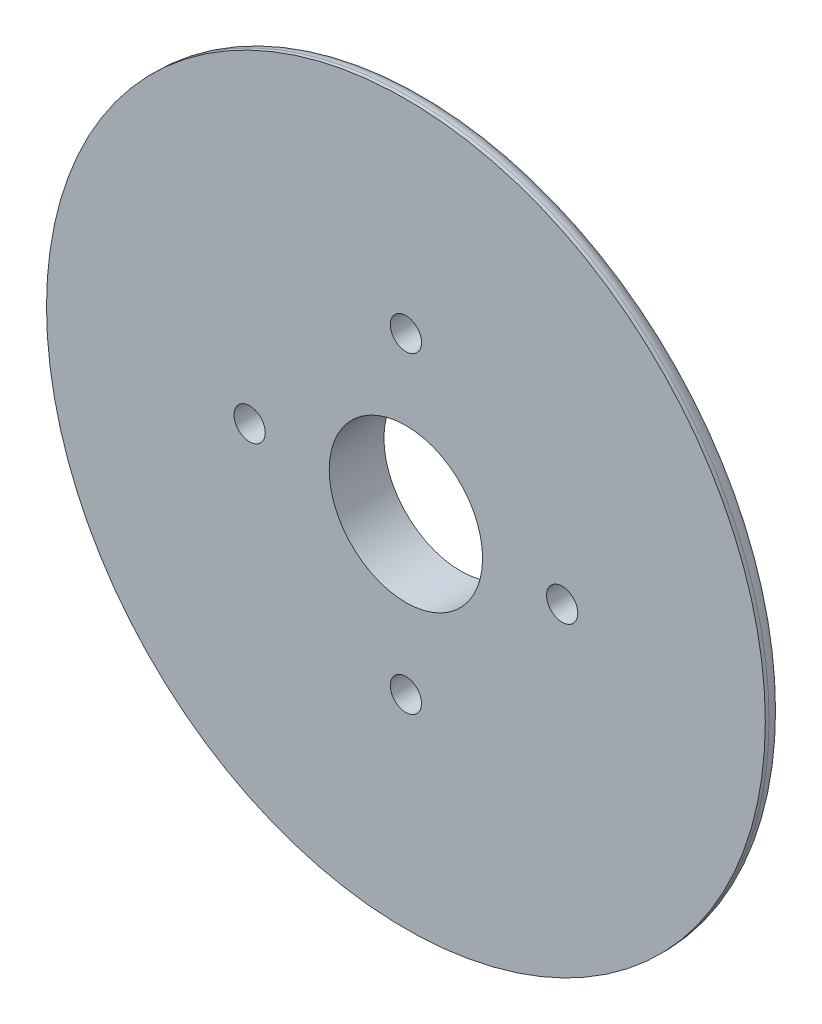
ISO-10303-21;
HEADER;
FILE_DESCRIPTION(('STEP AP214'),'2;1');
FILE_NAME('part.step','',(''),(''),'','','');
FILE_SCHEMA(('AUTOMOTIVE_DESIGN { 1 0 10303 214 1 1 1 1 }'));
ENDSEC;
DATA;
#1=APPLICATION_CONTEXT('core data for automotive mechanical design processes');
#2=APPLICATION_PROTOCOL_DEFINITION('international standard','automotive_design',2000,#1);
#3=PRODUCT_CONTEXT('',#1,'mechanical');
#4=PRODUCT('Part','Part','',(#3));
#5=PRODUCT_RELATED_PRODUCT_CATEGORY('part','',(#4));
#6=PRODUCT_DEFINITION_FORMATION('','',#4);
#7=PRODUCT_DEFINITION_CONTEXT('part definition',#1,'design');
#8=PRODUCT_DEFINITION('design','',#6,#7);
#9=PRODUCT_DEFINITION_SHAPE('','',#8);
#10=(LENGTH_UNIT() NAMED_UNIT(*) SI_UNIT(.MILLI.,.METRE.));
#11=(NAMED_UNIT(*) PLANE_ANGLE_UNIT() SI_UNIT($,.RADIAN.));
#12=(NAMED_UNIT(*) SI_UNIT($,.STERADIAN.) SOLID_ANGLE_UNIT());
#13=UNCERTAINTY_MEASURE_WITH_UNIT(LENGTH_MEASURE(1.E-05),#10,'distance_accuracy_value','');
#14=(GEOMETRIC_REPRESENTATION_CONTEXT(3) GLOBAL_UNCERTAINTY_ASSIGNED_CONTEXT((#13)) GLOBAL_UNIT_ASSIGNED_CONTEXT((#10,
#11,#12)) REPRESENTATION_CONTEXT('',''));
#15=CARTESIAN_POINT('',(0.,0.,0.));
#16=DIRECTION('',(0.,0.,1.));
#17=DIRECTION('',(1.,0.,0.));
#18=AXIS2_PLACEMENT_3D('',#15,#16,#17);
#19=CARTESIAN_POINT('',(0.,0.,-45.5));
#20=DIRECTION('',(0.,0.,1.));
#21=DIRECTION('',(1.,0.,0.));
#22=AXIS2_PLACEMENT_3D('',#19,#20,#21);
#23=CYLINDRICAL_SURFACE('',#22,46.);
#24=CARTESIAN_POINT('',(0.,0.,-38.979828700859));
#25=DIRECTION('',(0.,0.,-1.));
#26=DIRECTION('',(-1.,0.,0.));
#27=AXIS2_PLACEMENT_3D('',#24,#25,#26);
#28=CIRCLE('',#27,46.);
#29=CARTESIAN_POINT('',(-46.,0.,-38.979828700859));
#30=VERTEX_POINT('',#29);
#31=EDGE_CURVE('E43',#30,#30,#28,.F.);
#32=ORIENTED_EDGE('',*,*,#31,.T.);
#33=EDGE_LOOP('',(#32));
#34=FACE_BOUND('',#33,.T.);
#35=CARTESIAN_POINT('',(0.,0.,-38.5));
#36=DIRECTION('',(0.,0.,1.));
#37=DIRECTION('',(1.,0.,0.));
#38=AXIS2_PLACEMENT_3D('',#35,#36,#37);
#39=CIRCLE('',#38,46.);
#40=CARTESIAN_POINT('',(46.,0.,-38.5));
#41=VERTEX_POINT('',#40);
#42=EDGE_CURVE('E54',#41,#41,#39,.T.);
#43=ORIENTED_EDGE('',*,*,#42,.F.);
#44=EDGE_LOOP('',(#43));
#45=FACE_BOUND('',#44,.T.);
#46=ADVANCED_FACE('F35',(#34,#45),#23,.T.);
#47=CARTESIAN_POINT('',(0.,20.,-45.5));
#48=DIRECTION('',(0.,0.,-1.));
#49=DIRECTION('',(-1.,0.,0.));
#50=AXIS2_PLACEMENT_3D('',#47,#48,#49);
#51=CYLINDRICAL_SURFACE('',#50,1.99999999999999);
#52=CARTESIAN_POINT('',(0.,20.,-45.5));
#53=DIRECTION('',(0.,0.,-1.));
#54=DIRECTION('',(-1.,0.,0.));
#55=AXIS2_PLACEMENT_3D('',#52,#53,#54);
#56=CIRCLE('',#55,1.99999999999999);
#57=CARTESIAN_POINT('',(-1.99999999999999,20.,-45.5));
#58=VERTEX_POINT('',#57);
#59=EDGE_CURVE('E82',#58,#58,#56,.T.);
#60=ORIENTED_EDGE('',*,*,#59,.T.);
#61=EDGE_LOOP('',(#60));
#62=FACE_BOUND('',#61,.T.);
#63=CARTESIAN_POINT('',(0.,20.,-38.5));
#64=DIRECTION('',(0.,0.,1.));
#65=DIRECTION('',(1.,0.,0.));
#66=AXIS2_PLACEMENT_3D('',#63,#64,#65);
#67=CIRCLE('',#66,1.99999999999999);
#68=CARTESIAN_POINT('',(1.99999999999999,20.,-38.5));
#69=VERTEX_POINT('',#68);
#70=EDGE_CURVE('E70',#69,#69,#67,.F.);
#71=ORIENTED_EDGE('',*,*,#70,.F.);
#72=EDGE_LOOP('',(#71));
#73=FACE_BOUND('',#72,.T.);
#74=ADVANCED_FACE('F106',(#62,#73),#51,.F.);
#75=CARTESIAN_POINT('',(-20.,0.,-45.5));
#76=DIRECTION('',(0.,0.,-1.));
#77=DIRECTION('',(-1.,0.,0.));
#78=AXIS2_PLACEMENT_3D('',#75,#76,#77);
#79=CYLINDRICAL_SURFACE('',#78,1.99999999999999);
#80=CARTESIAN_POINT('',(-20.,0.,-45.5));
#81=DIRECTION('',(0.,0.,-1.));
#82=DIRECTION('',(-1.,0.,0.));
#83=AXIS2_PLACEMENT_3D('',#80,#81,#82);
#84=CIRCLE('',#83,1.99999999999999);
#85=CARTESIAN_POINT('',(-22.,0.,-45.5));
#86=VERTEX_POINT('',#85);
#87=EDGE_CURVE('E79',#86,#86,#84,.T.);
#88=ORIENTED_EDGE('',*,*,#87,.T.);
#89=EDGE_LOOP('',(#88));
#90=FACE_BOUND('',#89,.T.);
#91=CARTESIAN_POINT('',(-20.,0.,-38.5));
#92=DIRECTION('',(0.,0.,1.));
#93=DIRECTION('',(1.,0.,0.));
#94=AXIS2_PLACEMENT_3D('',#91,#92,#93);
#95=CIRCLE('',#94,1.99999999999999);
#96=CARTESIAN_POINT('',(-18.,0.,-38.5));
#97=VERTEX_POINT('',#96);
#98=EDGE_CURVE('E58',#97,#97,#95,.F.);
#99=ORIENTED_EDGE('',*,*,#98,.F.);
#100=EDGE_LOOP('',(#99));
#101=FACE_BOUND('',#100,.T.);
#102=ADVANCED_FACE('F112',(#90,#101),#79,.F.);
#103=CARTESIAN_POINT('',(20.,0.,-45.5));
#104=DIRECTION('',(0.,0.,-1.));
#105=DIRECTION('',(-1.,0.,0.));
#106=AXIS2_PLACEMENT_3D('',#103,#104,#105);
#107=CYLINDRICAL_SURFACE('',#106,1.99999999999999);
#108=CARTESIAN_POINT('',(20.,0.,-45.5));
#109=DIRECTION('',(0.,0.,-1.));
#110=DIRECTION('',(-1.,0.,0.));
#111=AXIS2_PLACEMENT_3D('',#108,#109,#110);
#112=CIRCLE('',#111,1.99999999999999);
#113=CARTESIAN_POINT('',(18.,0.,-45.5));
#114=VERTEX_POINT('',#113);
#115=EDGE_CURVE('E76',#114,#114,#112,.T.);
#116=ORIENTED_EDGE('',*,*,#115,.T.);
#117=EDGE_LOOP('',(#116));
#118=FACE_BOUND('',#117,.T.);
#119=CARTESIAN_POINT('',(20.,0.,-38.5));
#120=DIRECTION('',(0.,0.,1.));
#121=DIRECTION('',(1.,0.,0.));
#122=AXIS2_PLACEMENT_3D('',#119,#120,#121);
#123=CIRCLE('',#122,1.99999999999999);
#124=CARTESIAN_POINT('',(22.,0.,-38.5));
#125=VERTEX_POINT('',#124);
#126=EDGE_CURVE('E53',#125,#125,#123,.F.);
#127=ORIENTED_EDGE('',*,*,#126,.F.);
#128=EDGE_LOOP('',(#127));
#129=FACE_BOUND('',#128,.T.);
#130=ADVANCED_FACE('F119',(#118,#129),#107,.F.);
#131=CARTESIAN_POINT('',(0.,-20.,-45.5));
#132=DIRECTION('',(0.,0.,-1.));
#133=DIRECTION('',(-1.,0.,0.));
#134=AXIS2_PLACEMENT_3D('',#131,#132,#133);
#135=CYLINDRICAL_SURFACE('',#134,1.99999999999999);
#136=CARTESIAN_POINT('',(0.,-20.,-45.5));
#137=DIRECTION('',(0.,0.,-1.));
#138=DIRECTION('',(-1.,0.,0.));
#139=AXIS2_PLACEMENT_3D('',#136,#137,#138);
#140=CIRCLE('',#139,1.99999999999999);
#141=CARTESIAN_POINT('',(-1.99999999999999,-20.,-45.5));
#142=VERTEX_POINT('',#141);
#143=EDGE_CURVE('E73',#142,#142,#140,.T.);
#144=ORIENTED_EDGE('',*,*,#143,.T.);
#145=EDGE_LOOP('',(#144));
#146=FACE_BOUND('',#145,.T.);
#147=CARTESIAN_POINT('',(0.,-20.,-38.5));
#148=DIRECTION('',(0.,0.,1.));
#149=DIRECTION('',(1.,0.,0.));
#150=AXIS2_PLACEMENT_3D('',#147,#148,#149);
#151=CIRCLE('',#150,1.99999999999999);
#152=CARTESIAN_POINT('',(1.99999999999999,-20.,-38.5));
#153=VERTEX_POINT('',#152);
#154=EDGE_CURVE('E51',#153,#153,#151,.F.);
#155=ORIENTED_EDGE('',*,*,#154,.F.);
#156=EDGE_LOOP('',(#155));
#157=FACE_BOUND('',#156,.T.);
#158=ADVANCED_FACE('F101',(#146,#157),#135,.F.);
#159=CARTESIAN_POINT('',(0.,0.,-40.5));
#160=DIRECTION('',(0.,0.,1.));
#161=DIRECTION('',(1.,0.,0.));
#162=AXIS2_PLACEMENT_3D('',#159,#160,#161);
#163=CONICAL_SURFACE('',#162,46.,1.29984947645648);
#164=CARTESIAN_POINT('',(0.,0.,-40.9068645201189));
#165=DIRECTION('',(0.,0.,-1.));
#166=DIRECTION('',(-1.,0.,0.));
#167=AXIS2_PLACEMENT_3D('',#164,#165,#166);
#168=CIRCLE('',#167,44.5352877275722);
#169=CARTESIAN_POINT('',(-44.5352877275722,0.,-40.9068645201189));
#170=VERTEX_POINT('',#169);
#171=EDGE_CURVE('E10',#170,#170,#168,.T.);
#172=ORIENTED_EDGE('',*,*,#171,.T.);
#173=EDGE_LOOP('',(#172));
#174=FACE_BOUND('',#173,.T.);
#175=CARTESIAN_POINT('',(0.,0.,-45.5));
#176=DIRECTION('',(0.,0.,1.));
#177=DIRECTION('',(1.,0.,0.));
#178=AXIS2_PLACEMENT_3D('',#175,#176,#177);
#179=CIRCLE('',#178,27.9999999999998);
#180=CARTESIAN_POINT('',(27.9999999999998,0.,-45.5));
#181=VERTEX_POINT('',#180);
#182=EDGE_CURVE('E48',#181,#181,#179,.T.);
#183=ORIENTED_EDGE('',*,*,#182,.T.);
#184=EDGE_LOOP('',(#183));
#185=FACE_BOUND('',#184,.T.);
#186=ADVANCED_FACE('F87',(#174,#185),#163,.T.);
#187=CARTESIAN_POINT('',(27.9999999999998,0.,-45.5));
#188=DIRECTION('',(0.,0.,-1.));
#189=DIRECTION('',(-1.,0.,0.));
#190=AXIS2_PLACEMENT_3D('',#187,#188,#189);
#191=PLANE('',#190);
#192=CARTESIAN_POINT('',(0.,0.,-45.5));
#193=DIRECTION('',(0.,0.,-1.));
#194=DIRECTION('',(-1.,0.,0.));
#195=AXIS2_PLACEMENT_3D('',#192,#193,#194);
#196=CIRCLE('',#195,9.81495457622364);
#197=CARTESIAN_POINT('',(-9.81495457622364,0.,-45.5));
#198=VERTEX_POINT('',#197);
#199=EDGE_CURVE('E61',#198,#198,#196,.T.);
#200=ORIENTED_EDGE('',*,*,#199,.F.);
#201=EDGE_LOOP('',(#200));
#202=FACE_BOUND('',#201,.T.);
#203=ORIENTED_EDGE('',*,*,#143,.F.);
#204=EDGE_LOOP('',(#203));
#205=FACE_BOUND('',#204,.T.);
#206=ORIENTED_EDGE('',*,*,#115,.F.);
#207=EDGE_LOOP('',(#206));
#208=FACE_BOUND('',#207,.T.);
#209=ORIENTED_EDGE('',*,*,#87,.F.);
#210=EDGE_LOOP('',(#209));
#211=FACE_BOUND('',#210,.T.);
#212=ORIENTED_EDGE('',*,*,#59,.F.);
#213=EDGE_LOOP('',(#212));
#214=FACE_BOUND('',#213,.T.);
#215=ORIENTED_EDGE('',*,*,#182,.F.);
#216=EDGE_LOOP('',(#215));
#217=FACE_BOUND('',#216,.T.);
#218=ADVANCED_FACE('F89',(#202,#205,#208,#211,#214,#217),#191,.T.);
#219=CARTESIAN_POINT('',(0.,0.,-38.979828700859));
#220=DIRECTION('',(0.,0.,-1.));
#221=DIRECTION('',(-1.,0.,0.));
#222=AXIS2_PLACEMENT_3D('',#219,#220,#221);
#223=TOROIDAL_SURFACE('',#222,44.,2.);
#224=ORIENTED_EDGE('',*,*,#171,.F.);
#225=EDGE_LOOP('',(#224));
#226=FACE_BOUND('',#225,.T.);
#227=ORIENTED_EDGE('',*,*,#31,.F.);
#228=EDGE_LOOP('',(#227));
#229=FACE_BOUND('',#228,.T.);
#230=ADVANCED_FACE('F37',(#226,#229),#223,.T.);
#231=CARTESIAN_POINT('',(0.,0.,-38.5));
#232=DIRECTION('',(0.,0.,1.));
#233=DIRECTION('',(1.,0.,0.));
#234=AXIS2_PLACEMENT_3D('',#231,#232,#233);
#235=PLANE('',#234);
#236=CARTESIAN_POINT('',(0.,0.,-38.5));
#237=DIRECTION('',(0.,0.,1.));
#238=DIRECTION('',(1.,0.,0.));
#239=AXIS2_PLACEMENT_3D('',#236,#237,#238);
#240=CIRCLE('',#239,9.81495457622364);
#241=CARTESIAN_POINT('',(9.81495457622364,0.,-38.5));
#242=VERTEX_POINT('',#241);
#243=EDGE_CURVE('E39',#242,#242,#240,.T.);
#244=ORIENTED_EDGE('',*,*,#243,.F.);
#245=EDGE_LOOP('',(#244));
#246=FACE_BOUND('',#245,.T.);
#247=ORIENTED_EDGE('',*,*,#42,.T.);
#248=EDGE_LOOP('',(#247));
#249=FACE_BOUND('',#248,.T.);
#250=ORIENTED_EDGE('',*,*,#154,.T.);
#251=EDGE_LOOP('',(#250));
#252=FACE_BOUND('',#251,.T.);
#253=ORIENTED_EDGE('',*,*,#126,.T.);
#254=EDGE_LOOP('',(#253));
#255=FACE_BOUND('',#254,.T.);
#256=ORIENTED_EDGE('',*,*,#98,.T.);
#257=EDGE_LOOP('',(#256));
#258=FACE_BOUND('',#257,.T.);
#259=ORIENTED_EDGE('',*,*,#70,.T.);
#260=EDGE_LOOP('',(#259));
#261=FACE_BOUND('',#260,.T.);
#262=ADVANCED_FACE('F98',(#246,#249,#252,#255,#258,#261),#235,.T.);
#263=CARTESIAN_POINT('',(0.,0.,-28.5));
#264=DIRECTION('',(0.,0.,-1.));
#265=DIRECTION('',(-1.,0.,0.));
#266=AXIS2_PLACEMENT_3D('',#263,#264,#265);
#267=CYLINDRICAL_SURFACE('',#266,9.81495457622364);
#268=ORIENTED_EDGE('',*,*,#199,.T.);
#269=EDGE_LOOP('',(#268));
#270=FACE_BOUND('',#269,.T.);
#271=ORIENTED_EDGE('',*,*,#243,.T.);
#272=EDGE_LOOP('',(#271));
#273=FACE_BOUND('',#272,.T.);
#274=ADVANCED_FACE('F128',(#270,#273),#267,.F.);
#275=CLOSED_SHELL('',(#46,#74,#102,#130,#158,#186,#218,#230,#262,#274));
#276=MANIFOLD_SOLID_BREP('B2',#275);
#277=ADVANCED_BREP_SHAPE_REPRESENTATION('',(#18,#276),#14);
#278=SHAPE_DEFINITION_REPRESENTATION(#9,#277);
ENDSEC;
END-ISO-10303-21;
